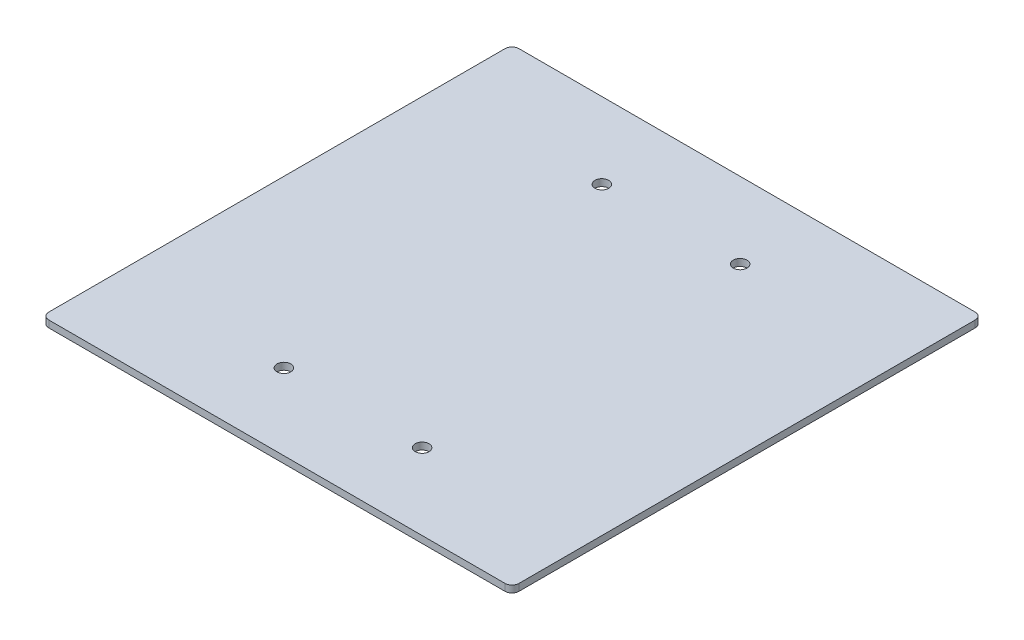
ISO-10303-21;
HEADER;
FILE_DESCRIPTION(('STEP AP214'),'2;1');
FILE_NAME('part.step','',(''),(''),'','','');
FILE_SCHEMA(('AUTOMOTIVE_DESIGN { 1 0 10303 214 1 1 1 1 }'));
ENDSEC;
DATA;
#1=APPLICATION_CONTEXT('core data for automotive mechanical design processes');
#2=APPLICATION_PROTOCOL_DEFINITION('international standard','automotive_design',2000,#1);
#3=PRODUCT_CONTEXT('',#1,'mechanical');
#4=PRODUCT('Part','Part','',(#3));
#5=PRODUCT_RELATED_PRODUCT_CATEGORY('part','',(#4));
#6=PRODUCT_DEFINITION_FORMATION('','',#4);
#7=PRODUCT_DEFINITION_CONTEXT('part definition',#1,'design');
#8=PRODUCT_DEFINITION('design','',#6,#7);
#9=PRODUCT_DEFINITION_SHAPE('','',#8);
#10=(LENGTH_UNIT() NAMED_UNIT(*) SI_UNIT(.MILLI.,.METRE.));
#11=(NAMED_UNIT(*) PLANE_ANGLE_UNIT() SI_UNIT($,.RADIAN.));
#12=(NAMED_UNIT(*) SI_UNIT($,.STERADIAN.) SOLID_ANGLE_UNIT());
#13=UNCERTAINTY_MEASURE_WITH_UNIT(LENGTH_MEASURE(1.E-05),#10,'distance_accuracy_value','');
#14=(GEOMETRIC_REPRESENTATION_CONTEXT(3) GLOBAL_UNCERTAINTY_ASSIGNED_CONTEXT((#13)) GLOBAL_UNIT_ASSIGNED_CONTEXT((#10,
#11,#12)) REPRESENTATION_CONTEXT('',''));
#15=CARTESIAN_POINT('',(0.,0.,0.));
#16=DIRECTION('',(0.,0.,1.));
#17=DIRECTION('',(1.,0.,0.));
#18=AXIS2_PLACEMENT_3D('',#15,#16,#17);
#19=CARTESIAN_POINT('',(0.,3.175,0.));
#20=DIRECTION('',(1.,0.,0.));
#21=DIRECTION('',(0.,0.,-1.));
#22=AXIS2_PLACEMENT_3D('',#19,#20,#21);
#23=PLANE('',#22);
#24=DIRECTION('',(0.,0.,1.));
#25=VECTOR('',#24,1.);
#26=CARTESIAN_POINT('',(0.,3.175,0.));
#27=LINE('',#26,#25);
#28=CARTESIAN_POINT('',(0.,3.175,-212.725));
#29=VERTEX_POINT('',#28);
#30=CARTESIAN_POINT('',(0.,3.175,-3.175));
#31=VERTEX_POINT('',#30);
#32=EDGE_CURVE('E125',#29,#31,#27,.T.);
#33=ORIENTED_EDGE('',*,*,#32,.F.);
#34=DIRECTION('',(0.,-1.,0.));
#35=VECTOR('',#34,1.);
#36=CARTESIAN_POINT('',(0.,3.175,-212.725));
#37=LINE('',#36,#35);
#38=CARTESIAN_POINT('',(0.,0.,-212.725));
#39=VERTEX_POINT('',#38);
#40=EDGE_CURVE('E151',#29,#39,#37,.T.);
#41=ORIENTED_EDGE('',*,*,#40,.T.);
#42=DIRECTION('',(0.,0.,1.));
#43=VECTOR('',#42,1.);
#44=CARTESIAN_POINT('',(0.,0.,0.));
#45=LINE('',#44,#43);
#46=CARTESIAN_POINT('',(0.,0.,-3.175));
#47=VERTEX_POINT('',#46);
#48=EDGE_CURVE('E157',#39,#47,#45,.T.);
#49=ORIENTED_EDGE('',*,*,#48,.T.);
#50=DIRECTION('',(0.,-1.,0.));
#51=VECTOR('',#50,1.);
#52=CARTESIAN_POINT('',(0.,3.175,-3.175));
#53=LINE('',#52,#51);
#54=EDGE_CURVE('E149',#47,#31,#53,.F.);
#55=ORIENTED_EDGE('',*,*,#54,.T.);
#56=EDGE_LOOP('',(#33,#41,#49,#55));
#57=FACE_BOUND('',#56,.T.);
#58=ADVANCED_FACE('F33',(#57),#23,.F.);
#59=CARTESIAN_POINT('',(0.,3.175,0.));
#60=DIRECTION('',(0.,0.,-1.));
#61=DIRECTION('',(-1.,0.,0.));
#62=AXIS2_PLACEMENT_3D('',#59,#60,#61);
#63=PLANE('',#62);
#64=DIRECTION('',(1.,0.,0.));
#65=VECTOR('',#64,1.);
#66=CARTESIAN_POINT('',(0.,3.175,0.));
#67=LINE('',#66,#65);
#68=CARTESIAN_POINT('',(3.175,3.175,0.));
#69=VERTEX_POINT('',#68);
#70=CARTESIAN_POINT('',(212.725,3.175,0.));
#71=VERTEX_POINT('',#70);
#72=EDGE_CURVE('E128',#69,#71,#67,.T.);
#73=ORIENTED_EDGE('',*,*,#72,.F.);
#74=DIRECTION('',(0.,-1.,0.));
#75=VECTOR('',#74,1.);
#76=CARTESIAN_POINT('',(3.175,3.175,0.));
#77=LINE('',#76,#75);
#78=CARTESIAN_POINT('',(3.175,0.,0.));
#79=VERTEX_POINT('',#78);
#80=EDGE_CURVE('E11',#69,#79,#77,.T.);
#81=ORIENTED_EDGE('',*,*,#80,.T.);
#82=DIRECTION('',(1.,0.,0.));
#83=VECTOR('',#82,1.);
#84=CARTESIAN_POINT('',(0.,0.,0.));
#85=LINE('',#84,#83);
#86=CARTESIAN_POINT('',(212.725,0.,0.));
#87=VERTEX_POINT('',#86);
#88=EDGE_CURVE('E130',#79,#87,#85,.T.);
#89=ORIENTED_EDGE('',*,*,#88,.T.);
#90=DIRECTION('',(0.,-1.,0.));
#91=VECTOR('',#90,1.);
#92=CARTESIAN_POINT('',(212.725,3.175,0.));
#93=LINE('',#92,#91);
#94=EDGE_CURVE('E41',#87,#71,#93,.F.);
#95=ORIENTED_EDGE('',*,*,#94,.T.);
#96=EDGE_LOOP('',(#73,#81,#89,#95));
#97=FACE_BOUND('',#96,.T.);
#98=ADVANCED_FACE('F211',(#97),#63,.F.);
#99=CARTESIAN_POINT('',(215.9,3.175,0.));
#100=DIRECTION('',(-1.,0.,0.));
#101=DIRECTION('',(0.,0.,1.));
#102=AXIS2_PLACEMENT_3D('',#99,#100,#101);
#103=PLANE('',#102);
#104=DIRECTION('',(0.,0.,-1.));
#105=VECTOR('',#104,1.);
#106=CARTESIAN_POINT('',(215.9,0.,0.));
#107=LINE('',#106,#105);
#108=CARTESIAN_POINT('',(215.9,0.,-3.175));
#109=VERTEX_POINT('',#108);
#110=CARTESIAN_POINT('',(215.9,0.,-212.725));
#111=VERTEX_POINT('',#110);
#112=EDGE_CURVE('E126',#109,#111,#107,.T.);
#113=ORIENTED_EDGE('',*,*,#112,.T.);
#114=DIRECTION('',(0.,-1.,0.));
#115=VECTOR('',#114,1.);
#116=CARTESIAN_POINT('',(215.9,3.175,-212.725));
#117=LINE('',#116,#115);
#118=CARTESIAN_POINT('',(215.9,3.175,-212.725));
#119=VERTEX_POINT('',#118);
#120=EDGE_CURVE('E104',#111,#119,#117,.F.);
#121=ORIENTED_EDGE('',*,*,#120,.T.);
#122=DIRECTION('',(0.,0.,-1.));
#123=VECTOR('',#122,1.);
#124=CARTESIAN_POINT('',(215.9,3.175,0.));
#125=LINE('',#124,#123);
#126=CARTESIAN_POINT('',(215.9,3.175,-3.175));
#127=VERTEX_POINT('',#126);
#128=EDGE_CURVE('E169',#127,#119,#125,.T.);
#129=ORIENTED_EDGE('',*,*,#128,.F.);
#130=DIRECTION('',(0.,-1.,0.));
#131=VECTOR('',#130,1.);
#132=CARTESIAN_POINT('',(215.9,3.175,-3.175));
#133=LINE('',#132,#131);
#134=EDGE_CURVE('E109',#127,#109,#133,.T.);
#135=ORIENTED_EDGE('',*,*,#134,.T.);
#136=EDGE_LOOP('',(#113,#121,#129,#135));
#137=FACE_BOUND('',#136,.T.);
#138=ADVANCED_FACE('F209',(#137),#103,.F.);
#139=CARTESIAN_POINT('',(0.,3.175,-215.9));
#140=DIRECTION('',(0.,0.,1.));
#141=DIRECTION('',(1.,0.,0.));
#142=AXIS2_PLACEMENT_3D('',#139,#140,#141);
#143=PLANE('',#142);
#144=DIRECTION('',(-1.,0.,0.));
#145=VECTOR('',#144,1.);
#146=CARTESIAN_POINT('',(0.,3.175,-215.9));
#147=LINE('',#146,#145);
#148=CARTESIAN_POINT('',(212.725,3.175,-215.9));
#149=VERTEX_POINT('',#148);
#150=CARTESIAN_POINT('',(3.175,3.175,-215.9));
#151=VERTEX_POINT('',#150);
#152=EDGE_CURVE('E119',#149,#151,#147,.T.);
#153=ORIENTED_EDGE('',*,*,#152,.F.);
#154=DIRECTION('',(0.,-1.,0.));
#155=VECTOR('',#154,1.);
#156=CARTESIAN_POINT('',(212.725,3.175,-215.9));
#157=LINE('',#156,#155);
#158=CARTESIAN_POINT('',(212.725,0.,-215.9));
#159=VERTEX_POINT('',#158);
#160=EDGE_CURVE('E103',#149,#159,#157,.T.);
#161=ORIENTED_EDGE('',*,*,#160,.T.);
#162=DIRECTION('',(-1.,0.,0.));
#163=VECTOR('',#162,1.);
#164=CARTESIAN_POINT('',(0.,0.,-215.9));
#165=LINE('',#164,#163);
#166=CARTESIAN_POINT('',(3.175,0.,-215.9));
#167=VERTEX_POINT('',#166);
#168=EDGE_CURVE('E116',#159,#167,#165,.T.);
#169=ORIENTED_EDGE('',*,*,#168,.T.);
#170=DIRECTION('',(0.,-1.,0.));
#171=VECTOR('',#170,1.);
#172=CARTESIAN_POINT('',(3.175,3.175,-215.9));
#173=LINE('',#172,#171);
#174=EDGE_CURVE('E121',#167,#151,#173,.F.);
#175=ORIENTED_EDGE('',*,*,#174,.T.);
#176=EDGE_LOOP('',(#153,#161,#169,#175));
#177=FACE_BOUND('',#176,.T.);
#178=ADVANCED_FACE('F115',(#177),#143,.F.);
#179=CARTESIAN_POINT('',(0.,3.175,0.));
#180=DIRECTION('',(0.,-1.,0.));
#181=DIRECTION('',(0.,0.,-1.));
#182=AXIS2_PLACEMENT_3D('',#179,#180,#181);
#183=PLANE('',#182);
#184=CARTESIAN_POINT('',(76.2,3.175,-34.925));
#185=DIRECTION('',(0.,1.,0.));
#186=DIRECTION('',(0.,0.,1.));
#187=AXIS2_PLACEMENT_3D('',#184,#185,#186);
#188=CIRCLE('',#187,3.175);
#189=CARTESIAN_POINT('',(76.2,3.175,-31.75));
#190=VERTEX_POINT('',#189);
#191=EDGE_CURVE('E185',#190,#190,#188,.T.);
#192=ORIENTED_EDGE('',*,*,#191,.F.);
#193=EDGE_LOOP('',(#192));
#194=FACE_BOUND('',#193,.T.);
#195=CARTESIAN_POINT('',(139.7,3.175,-34.925));
#196=DIRECTION('',(0.,1.,0.));
#197=DIRECTION('',(0.,0.,1.));
#198=AXIS2_PLACEMENT_3D('',#195,#196,#197);
#199=CIRCLE('',#198,3.175);
#200=CARTESIAN_POINT('',(139.7,3.175,-31.75));
#201=VERTEX_POINT('',#200);
#202=EDGE_CURVE('E179',#201,#201,#199,.T.);
#203=ORIENTED_EDGE('',*,*,#202,.F.);
#204=EDGE_LOOP('',(#203));
#205=FACE_BOUND('',#204,.T.);
#206=CARTESIAN_POINT('',(139.7,3.175,-180.975));
#207=DIRECTION('',(0.,1.,0.));
#208=DIRECTION('',(0.,0.,1.));
#209=AXIS2_PLACEMENT_3D('',#206,#207,#208);
#210=CIRCLE('',#209,3.175);
#211=CARTESIAN_POINT('',(139.7,3.175,-177.8));
#212=VERTEX_POINT('',#211);
#213=EDGE_CURVE('E174',#212,#212,#210,.T.);
#214=ORIENTED_EDGE('',*,*,#213,.F.);
#215=EDGE_LOOP('',(#214));
#216=FACE_BOUND('',#215,.T.);
#217=CARTESIAN_POINT('',(76.2,3.175,-180.975));
#218=DIRECTION('',(0.,1.,0.));
#219=DIRECTION('',(0.,0.,1.));
#220=AXIS2_PLACEMENT_3D('',#217,#218,#219);
#221=CIRCLE('',#220,3.175);
#222=CARTESIAN_POINT('',(76.2,3.175,-177.8));
#223=VERTEX_POINT('',#222);
#224=EDGE_CURVE('E165',#223,#223,#221,.T.);
#225=ORIENTED_EDGE('',*,*,#224,.F.);
#226=EDGE_LOOP('',(#225));
#227=FACE_BOUND('',#226,.T.);
#228=ORIENTED_EDGE('',*,*,#128,.T.);
#229=CARTESIAN_POINT('',(212.725,3.175,-212.725));
#230=DIRECTION('',(0.,-1.,0.));
#231=DIRECTION('',(0.,0.,-1.));
#232=AXIS2_PLACEMENT_3D('',#229,#230,#231);
#233=CIRCLE('',#232,3.175);
#234=EDGE_CURVE('E147',#119,#149,#233,.F.);
#235=ORIENTED_EDGE('',*,*,#234,.T.);
#236=ORIENTED_EDGE('',*,*,#152,.T.);
#237=CARTESIAN_POINT('',(3.175,3.175,-212.725));
#238=DIRECTION('',(0.,-1.,0.));
#239=DIRECTION('',(0.,0.,-1.));
#240=AXIS2_PLACEMENT_3D('',#237,#238,#239);
#241=CIRCLE('',#240,3.175);
#242=EDGE_CURVE('E145',#151,#29,#241,.F.);
#243=ORIENTED_EDGE('',*,*,#242,.T.);
#244=ORIENTED_EDGE('',*,*,#32,.T.);
#245=CARTESIAN_POINT('',(3.175,3.175,-3.175));
#246=DIRECTION('',(0.,-1.,0.));
#247=DIRECTION('',(0.,0.,-1.));
#248=AXIS2_PLACEMENT_3D('',#245,#246,#247);
#249=CIRCLE('',#248,3.175);
#250=EDGE_CURVE('E54',#31,#69,#249,.F.);
#251=ORIENTED_EDGE('',*,*,#250,.T.);
#252=ORIENTED_EDGE('',*,*,#72,.T.);
#253=CARTESIAN_POINT('',(212.725,3.175,-3.175));
#254=DIRECTION('',(0.,-1.,0.));
#255=DIRECTION('',(0.,0.,-1.));
#256=AXIS2_PLACEMENT_3D('',#253,#254,#255);
#257=CIRCLE('',#256,3.175);
#258=EDGE_CURVE('E142',#71,#127,#257,.F.);
#259=ORIENTED_EDGE('',*,*,#258,.T.);
#260=EDGE_LOOP('',(#228,#235,#236,#243,#244,#251,#252,#259));
#261=FACE_BOUND('',#260,.T.);
#262=ADVANCED_FACE('F196',(#194,#205,#216,#227,#261),#183,.F.);
#263=CARTESIAN_POINT('',(0.,0.,0.));
#264=DIRECTION('',(0.,-1.,0.));
#265=DIRECTION('',(0.,0.,-1.));
#266=AXIS2_PLACEMENT_3D('',#263,#264,#265);
#267=PLANE('',#266);
#268=CARTESIAN_POINT('',(76.2,0.,-34.925));
#269=DIRECTION('',(0.,1.,0.));
#270=DIRECTION('',(0.,0.,1.));
#271=AXIS2_PLACEMENT_3D('',#268,#269,#270);
#272=CIRCLE('',#271,3.175);
#273=CARTESIAN_POINT('',(76.2,0.,-31.75));
#274=VERTEX_POINT('',#273);
#275=EDGE_CURVE('E188',#274,#274,#272,.T.);
#276=ORIENTED_EDGE('',*,*,#275,.T.);
#277=EDGE_LOOP('',(#276));
#278=FACE_BOUND('',#277,.T.);
#279=CARTESIAN_POINT('',(139.7,0.,-34.925));
#280=DIRECTION('',(0.,1.,0.));
#281=DIRECTION('',(0.,0.,1.));
#282=AXIS2_PLACEMENT_3D('',#279,#280,#281);
#283=CIRCLE('',#282,3.175);
#284=CARTESIAN_POINT('',(139.7,0.,-31.75));
#285=VERTEX_POINT('',#284);
#286=EDGE_CURVE('E182',#285,#285,#283,.T.);
#287=ORIENTED_EDGE('',*,*,#286,.T.);
#288=EDGE_LOOP('',(#287));
#289=FACE_BOUND('',#288,.T.);
#290=CARTESIAN_POINT('',(139.7,0.,-180.975));
#291=DIRECTION('',(0.,1.,0.));
#292=DIRECTION('',(0.,0.,1.));
#293=AXIS2_PLACEMENT_3D('',#290,#291,#292);
#294=CIRCLE('',#293,3.175);
#295=CARTESIAN_POINT('',(139.7,0.,-177.8));
#296=VERTEX_POINT('',#295);
#297=EDGE_CURVE('E176',#296,#296,#294,.T.);
#298=ORIENTED_EDGE('',*,*,#297,.T.);
#299=EDGE_LOOP('',(#298));
#300=FACE_BOUND('',#299,.T.);
#301=CARTESIAN_POINT('',(76.2,0.,-180.975));
#302=DIRECTION('',(0.,1.,0.));
#303=DIRECTION('',(0.,0.,1.));
#304=AXIS2_PLACEMENT_3D('',#301,#302,#303);
#305=CIRCLE('',#304,3.175);
#306=CARTESIAN_POINT('',(76.2,0.,-177.8));
#307=VERTEX_POINT('',#306);
#308=EDGE_CURVE('E162',#307,#307,#305,.T.);
#309=ORIENTED_EDGE('',*,*,#308,.T.);
#310=EDGE_LOOP('',(#309));
#311=FACE_BOUND('',#310,.T.);
#312=ORIENTED_EDGE('',*,*,#168,.F.);
#313=CARTESIAN_POINT('',(212.725,0.,-212.725));
#314=DIRECTION('',(0.,-1.,0.));
#315=DIRECTION('',(0.,0.,-1.));
#316=AXIS2_PLACEMENT_3D('',#313,#314,#315);
#317=CIRCLE('',#316,3.175);
#318=EDGE_CURVE('E99',#159,#111,#317,.T.);
#319=ORIENTED_EDGE('',*,*,#318,.T.);
#320=ORIENTED_EDGE('',*,*,#112,.F.);
#321=CARTESIAN_POINT('',(212.725,0.,-3.175));
#322=DIRECTION('',(0.,-1.,0.));
#323=DIRECTION('',(0.,0.,-1.));
#324=AXIS2_PLACEMENT_3D('',#321,#322,#323);
#325=CIRCLE('',#324,3.175);
#326=EDGE_CURVE('E120',#109,#87,#325,.T.);
#327=ORIENTED_EDGE('',*,*,#326,.T.);
#328=ORIENTED_EDGE('',*,*,#88,.F.);
#329=CARTESIAN_POINT('',(3.175,0.,-3.175));
#330=DIRECTION('',(0.,-1.,0.));
#331=DIRECTION('',(0.,0.,-1.));
#332=AXIS2_PLACEMENT_3D('',#329,#330,#331);
#333=CIRCLE('',#332,3.175);
#334=EDGE_CURVE('E136',#79,#47,#333,.T.);
#335=ORIENTED_EDGE('',*,*,#334,.T.);
#336=ORIENTED_EDGE('',*,*,#48,.F.);
#337=CARTESIAN_POINT('',(3.175,0.,-212.725));
#338=DIRECTION('',(0.,-1.,0.));
#339=DIRECTION('',(0.,0.,-1.));
#340=AXIS2_PLACEMENT_3D('',#337,#338,#339);
#341=CIRCLE('',#340,3.175);
#342=EDGE_CURVE('E110',#39,#167,#341,.T.);
#343=ORIENTED_EDGE('',*,*,#342,.T.);
#344=EDGE_LOOP('',(#312,#319,#320,#327,#328,#335,#336,#343));
#345=FACE_BOUND('',#344,.T.);
#346=ADVANCED_FACE('F123',(#278,#289,#300,#311,#345),#267,.T.);
#347=CARTESIAN_POINT('',(212.725,3.175,-212.725));
#348=DIRECTION('',(0.,-1.,0.));
#349=DIRECTION('',(0.,0.,-1.));
#350=AXIS2_PLACEMENT_3D('',#347,#348,#349);
#351=CYLINDRICAL_SURFACE('',#350,3.175);
#352=ORIENTED_EDGE('',*,*,#234,.F.);
#353=ORIENTED_EDGE('',*,*,#120,.F.);
#354=ORIENTED_EDGE('',*,*,#318,.F.);
#355=ORIENTED_EDGE('',*,*,#160,.F.);
#356=EDGE_LOOP('',(#352,#353,#354,#355));
#357=FACE_BOUND('',#356,.T.);
#358=ADVANCED_FACE('F102',(#357),#351,.T.);
#359=CARTESIAN_POINT('',(3.175,3.175,-212.725));
#360=DIRECTION('',(0.,-1.,0.));
#361=DIRECTION('',(0.,0.,-1.));
#362=AXIS2_PLACEMENT_3D('',#359,#360,#361);
#363=CYLINDRICAL_SURFACE('',#362,3.175);
#364=ORIENTED_EDGE('',*,*,#242,.F.);
#365=ORIENTED_EDGE('',*,*,#174,.F.);
#366=ORIENTED_EDGE('',*,*,#342,.F.);
#367=ORIENTED_EDGE('',*,*,#40,.F.);
#368=EDGE_LOOP('',(#364,#365,#366,#367));
#369=FACE_BOUND('',#368,.T.);
#370=ADVANCED_FACE('F215',(#369),#363,.T.);
#371=CARTESIAN_POINT('',(3.175,3.175,-3.175));
#372=DIRECTION('',(0.,-1.,0.));
#373=DIRECTION('',(0.,0.,-1.));
#374=AXIS2_PLACEMENT_3D('',#371,#372,#373);
#375=CYLINDRICAL_SURFACE('',#374,3.175);
#376=ORIENTED_EDGE('',*,*,#250,.F.);
#377=ORIENTED_EDGE('',*,*,#54,.F.);
#378=ORIENTED_EDGE('',*,*,#334,.F.);
#379=ORIENTED_EDGE('',*,*,#80,.F.);
#380=EDGE_LOOP('',(#376,#377,#378,#379));
#381=FACE_BOUND('',#380,.T.);
#382=ADVANCED_FACE('F214',(#381),#375,.T.);
#383=CARTESIAN_POINT('',(212.725,3.175,-3.175));
#384=DIRECTION('',(0.,-1.,0.));
#385=DIRECTION('',(0.,0.,-1.));
#386=AXIS2_PLACEMENT_3D('',#383,#384,#385);
#387=CYLINDRICAL_SURFACE('',#386,3.175);
#388=ORIENTED_EDGE('',*,*,#258,.F.);
#389=ORIENTED_EDGE('',*,*,#94,.F.);
#390=ORIENTED_EDGE('',*,*,#326,.F.);
#391=ORIENTED_EDGE('',*,*,#134,.F.);
#392=EDGE_LOOP('',(#388,#389,#390,#391));
#393=FACE_BOUND('',#392,.T.);
#394=ADVANCED_FACE('F35',(#393),#387,.T.);
#395=CARTESIAN_POINT('',(76.2,0.,-180.975));
#396=DIRECTION('',(0.,1.,0.));
#397=DIRECTION('',(0.,0.,1.));
#398=AXIS2_PLACEMENT_3D('',#395,#396,#397);
#399=CYLINDRICAL_SURFACE('',#398,3.175);
#400=ORIENTED_EDGE('',*,*,#308,.F.);
#401=EDGE_LOOP('',(#400));
#402=FACE_BOUND('',#401,.T.);
#403=ORIENTED_EDGE('',*,*,#224,.T.);
#404=EDGE_LOOP('',(#403));
#405=FACE_BOUND('',#404,.T.);
#406=ADVANCED_FACE('F237',(#402,#405),#399,.F.);
#407=CARTESIAN_POINT('',(139.7,0.,-180.975));
#408=DIRECTION('',(0.,1.,0.));
#409=DIRECTION('',(0.,0.,1.));
#410=AXIS2_PLACEMENT_3D('',#407,#408,#409);
#411=CYLINDRICAL_SURFACE('',#410,3.175);
#412=ORIENTED_EDGE('',*,*,#297,.F.);
#413=EDGE_LOOP('',(#412));
#414=FACE_BOUND('',#413,.T.);
#415=ORIENTED_EDGE('',*,*,#213,.T.);
#416=EDGE_LOOP('',(#415));
#417=FACE_BOUND('',#416,.T.);
#418=ADVANCED_FACE('F240',(#414,#417),#411,.F.);
#419=CARTESIAN_POINT('',(139.7,0.,-34.925));
#420=DIRECTION('',(0.,1.,0.));
#421=DIRECTION('',(0.,0.,1.));
#422=AXIS2_PLACEMENT_3D('',#419,#420,#421);
#423=CYLINDRICAL_SURFACE('',#422,3.175);
#424=ORIENTED_EDGE('',*,*,#286,.F.);
#425=EDGE_LOOP('',(#424));
#426=FACE_BOUND('',#425,.T.);
#427=ORIENTED_EDGE('',*,*,#202,.T.);
#428=EDGE_LOOP('',(#427));
#429=FACE_BOUND('',#428,.T.);
#430=ADVANCED_FACE('F244',(#426,#429),#423,.F.);
#431=CARTESIAN_POINT('',(76.2,0.,-34.925));
#432=DIRECTION('',(0.,1.,0.));
#433=DIRECTION('',(0.,0.,1.));
#434=AXIS2_PLACEMENT_3D('',#431,#432,#433);
#435=CYLINDRICAL_SURFACE('',#434,3.175);
#436=ORIENTED_EDGE('',*,*,#275,.F.);
#437=EDGE_LOOP('',(#436));
#438=FACE_BOUND('',#437,.T.);
#439=ORIENTED_EDGE('',*,*,#191,.T.);
#440=EDGE_LOOP('',(#439));
#441=FACE_BOUND('',#440,.T.);
#442=ADVANCED_FACE('F194',(#438,#441),#435,.F.);
#443=CLOSED_SHELL('',(#58,#98,#138,#178,#262,#346,#358,#370,#382,#394,#406,#418,#430,#442));
#444=MANIFOLD_SOLID_BREP('B2',#443);
#445=ADVANCED_BREP_SHAPE_REPRESENTATION('',(#18,#444),#14);
#446=SHAPE_DEFINITION_REPRESENTATION(#9,#445);
ENDSEC;
END-ISO-10303-21;
